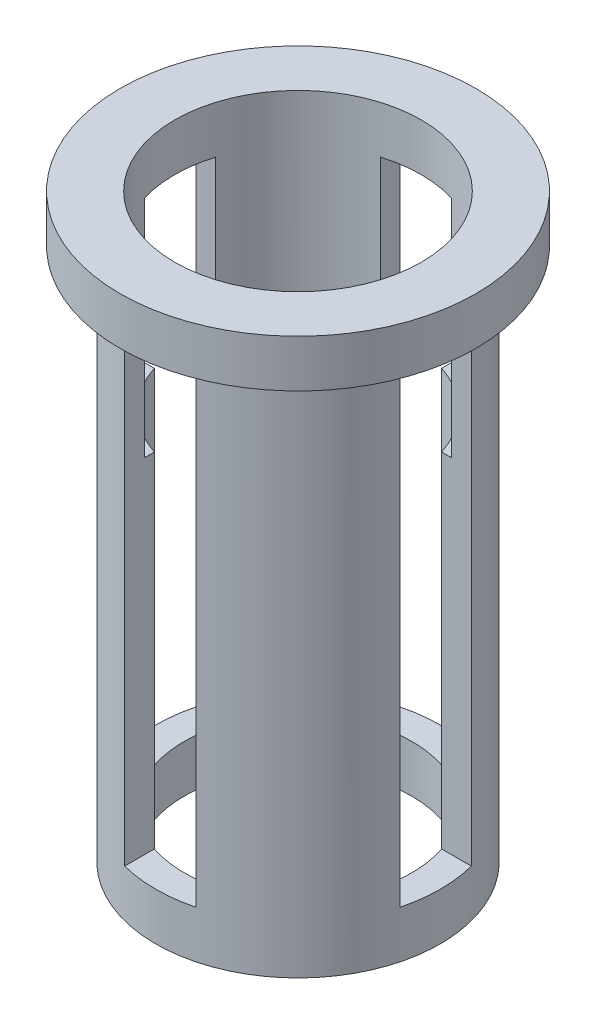
ISO-10303-21;
HEADER;
FILE_DESCRIPTION(('STEP AP214'),'2;1');
FILE_NAME('part.step','',(''),(''),'','','');
FILE_SCHEMA(('AUTOMOTIVE_DESIGN { 1 0 10303 214 1 1 1 1 }'));
ENDSEC;
DATA;
#1=APPLICATION_CONTEXT('core data for automotive mechanical design processes');
#2=APPLICATION_PROTOCOL_DEFINITION('international standard','automotive_design',2000,#1);
#3=PRODUCT_CONTEXT('',#1,'mechanical');
#4=PRODUCT('Part','Part','',(#3));
#5=PRODUCT_RELATED_PRODUCT_CATEGORY('part','',(#4));
#6=PRODUCT_DEFINITION_FORMATION('','',#4);
#7=PRODUCT_DEFINITION_CONTEXT('part definition',#1,'design');
#8=PRODUCT_DEFINITION('design','',#6,#7);
#9=PRODUCT_DEFINITION_SHAPE('','',#8);
#10=(LENGTH_UNIT() NAMED_UNIT(*) SI_UNIT(.MILLI.,.METRE.));
#11=(NAMED_UNIT(*) PLANE_ANGLE_UNIT() SI_UNIT($,.RADIAN.));
#12=(NAMED_UNIT(*) SI_UNIT($,.STERADIAN.) SOLID_ANGLE_UNIT());
#13=UNCERTAINTY_MEASURE_WITH_UNIT(LENGTH_MEASURE(1.E-05),#10,'distance_accuracy_value','');
#14=(GEOMETRIC_REPRESENTATION_CONTEXT(3) GLOBAL_UNCERTAINTY_ASSIGNED_CONTEXT((#13)) GLOBAL_UNIT_ASSIGNED_CONTEXT((#10,
#11,#12)) REPRESENTATION_CONTEXT('',''));
#15=CARTESIAN_POINT('',(0.,0.,0.));
#16=DIRECTION('',(0.,0.,1.));
#17=DIRECTION('',(1.,0.,0.));
#18=AXIS2_PLACEMENT_3D('',#15,#16,#17);
#19=CARTESIAN_POINT('',(0.,-7.62,0.));
#20=DIRECTION('',(0.,-1.,0.));
#21=DIRECTION('',(0.,0.,-1.));
#22=AXIS2_PLACEMENT_3D('',#19,#20,#21);
#23=PLANE('',#22);
#24=DIRECTION('',(1.,0.,0.));
#25=VECTOR('',#24,1.);
#26=CARTESIAN_POINT('',(0.,-7.62,1.905));
#27=LINE('',#26,#25);
#28=CARTESIAN_POINT('',(5.79069866251042,-7.62,1.905));
#29=VERTEX_POINT('',#28);
#30=CARTESIAN_POINT('',(6.32327375652834,-7.62,1.905));
#31=VERTEX_POINT('',#30);
#32=EDGE_CURVE('E209',#29,#31,#27,.T.);
#33=ORIENTED_EDGE('',*,*,#32,.F.);
#34=CARTESIAN_POINT('',(0.,-7.62,0.));
#35=DIRECTION('',(0.,-1.,0.));
#36=DIRECTION('',(0.,0.,-1.));
#37=AXIS2_PLACEMENT_3D('',#34,#35,#36);
#38=CIRCLE('',#37,6.096);
#39=CARTESIAN_POINT('',(1.905,-7.62,5.79069866251042));
#40=VERTEX_POINT('',#39);
#41=EDGE_CURVE('E293',#29,#40,#38,.T.);
#42=ORIENTED_EDGE('',*,*,#41,.T.);
#43=DIRECTION('',(0.,0.,1.));
#44=VECTOR('',#43,1.);
#45=CARTESIAN_POINT('',(1.90499999999999,-7.62,0.));
#46=LINE('',#45,#44);
#47=CARTESIAN_POINT('',(1.90499999999999,-7.62,6.32327375652834));
#48=VERTEX_POINT('',#47);
#49=EDGE_CURVE('E268',#40,#48,#46,.T.);
#50=ORIENTED_EDGE('',*,*,#49,.T.);
#51=CARTESIAN_POINT('',(0.,-7.62,0.));
#52=DIRECTION('',(0.,-1.,0.));
#53=DIRECTION('',(0.,0.,-1.));
#54=AXIS2_PLACEMENT_3D('',#51,#52,#53);
#55=CIRCLE('',#54,6.604);
#56=EDGE_CURVE('E303',#31,#48,#55,.T.);
#57=ORIENTED_EDGE('',*,*,#56,.F.);
#58=EDGE_LOOP('',(#33,#42,#50,#57));
#59=FACE_BOUND('',#58,.T.);
#60=ADVANCED_FACE('F41',(#59),#23,.F.);
#61=CARTESIAN_POINT('',(0.,2.54,0.));
#62=DIRECTION('',(0.,-1.,0.));
#63=DIRECTION('',(0.,0.,-1.));
#64=AXIS2_PLACEMENT_3D('',#61,#62,#63);
#65=CYLINDRICAL_SURFACE('',#64,6.604);
#66=CARTESIAN_POINT('',(0.,2.54,0.));
#67=DIRECTION('',(0.,1.,0.));
#68=DIRECTION('',(0.,0.,1.));
#69=AXIS2_PLACEMENT_3D('',#66,#67,#68);
#70=CIRCLE('',#69,6.604);
#71=CARTESIAN_POINT('',(0.,2.54,6.604));
#72=VERTEX_POINT('',#71);
#73=EDGE_CURVE('E302',#72,#72,#70,.T.);
#74=ORIENTED_EDGE('',*,*,#73,.T.);
#75=EDGE_LOOP('',(#74));
#76=FACE_BOUND('',#75,.T.);
#77=CARTESIAN_POINT('',(0.,0.,0.));
#78=DIRECTION('',(0.,1.,0.));
#79=DIRECTION('',(-1.,0.,0.));
#80=AXIS2_PLACEMENT_3D('',#77,#78,#79);
#81=CIRCLE('',#80,6.604);
#82=CARTESIAN_POINT('',(6.32327375652834,0.,1.905));
#83=VERTEX_POINT('',#82);
#84=CARTESIAN_POINT('',(6.32327375652834,0.,-1.90499999999999));
#85=VERTEX_POINT('',#84);
#86=EDGE_CURVE('E233',#83,#85,#81,.T.);
#87=ORIENTED_EDGE('',*,*,#86,.F.);
#88=DIRECTION('',(0.,-1.,0.));
#89=VECTOR('',#88,1.);
#90=CARTESIAN_POINT('',(6.32327375652834,2.54,1.905));
#91=LINE('',#90,#89);
#92=EDGE_CURVE('E415',#83,#31,#91,.T.);
#93=ORIENTED_EDGE('',*,*,#92,.T.);
#94=ORIENTED_EDGE('',*,*,#56,.T.);
#95=DIRECTION('',(0.,-1.,0.));
#96=VECTOR('',#95,1.);
#97=CARTESIAN_POINT('',(1.90499999999999,2.54,6.32327375652834));
#98=LINE('',#97,#96);
#99=CARTESIAN_POINT('',(1.90499999999999,0.,6.32327375652834));
#100=VERTEX_POINT('',#99);
#101=EDGE_CURVE('E271',#100,#48,#98,.T.);
#102=ORIENTED_EDGE('',*,*,#101,.F.);
#103=CARTESIAN_POINT('',(0.,0.,0.));
#104=DIRECTION('',(0.,1.,0.));
#105=DIRECTION('',(0.,0.,1.));
#106=AXIS2_PLACEMENT_3D('',#103,#104,#105);
#107=CIRCLE('',#106,6.604);
#108=CARTESIAN_POINT('',(-1.905,0.,6.32327375652834));
#109=VERTEX_POINT('',#108);
#110=EDGE_CURVE('E283',#109,#100,#107,.T.);
#111=ORIENTED_EDGE('',*,*,#110,.F.);
#112=DIRECTION('',(0.,-1.,0.));
#113=VECTOR('',#112,1.);
#114=CARTESIAN_POINT('',(-1.905,2.54,6.32327375652834));
#115=LINE('',#114,#113);
#116=CARTESIAN_POINT('',(-1.905,-7.62,6.32327375652834));
#117=VERTEX_POINT('',#116);
#118=EDGE_CURVE('E256',#117,#109,#115,.F.);
#119=ORIENTED_EDGE('',*,*,#118,.F.);
#120=CARTESIAN_POINT('',(-6.32327375652834,-7.62,1.905));
#121=VERTEX_POINT('',#120);
#122=EDGE_CURVE('E304',#117,#121,#55,.T.);
#123=ORIENTED_EDGE('',*,*,#122,.T.);
#124=DIRECTION('',(0.,-1.,0.));
#125=VECTOR('',#124,1.);
#126=CARTESIAN_POINT('',(-6.32327375652834,2.54,1.905));
#127=LINE('',#126,#125);
#128=CARTESIAN_POINT('',(-6.32327375652834,0.,1.905));
#129=VERTEX_POINT('',#128);
#130=EDGE_CURVE('E420',#121,#129,#127,.F.);
#131=ORIENTED_EDGE('',*,*,#130,.T.);
#132=CARTESIAN_POINT('',(-6.32327375652834,0.,-1.90499999999999));
#133=VERTEX_POINT('',#132);
#134=EDGE_CURVE('E227',#133,#129,#81,.T.);
#135=ORIENTED_EDGE('',*,*,#134,.F.);
#136=DIRECTION('',(0.,-1.,0.));
#137=VECTOR('',#136,1.);
#138=CARTESIAN_POINT('',(-6.32327375652834,2.54,-1.90499999999999));
#139=LINE('',#138,#137);
#140=CARTESIAN_POINT('',(-6.32327375652834,-7.62,-1.905));
#141=VERTEX_POINT('',#140);
#142=EDGE_CURVE('E408',#141,#133,#139,.F.);
#143=ORIENTED_EDGE('',*,*,#142,.F.);
#144=CARTESIAN_POINT('',(-1.905,-7.62,-6.32327375652834));
#145=VERTEX_POINT('',#144);
#146=EDGE_CURVE('E298',#141,#145,#55,.T.);
#147=ORIENTED_EDGE('',*,*,#146,.T.);
#148=DIRECTION('',(0.,-1.,0.));
#149=VECTOR('',#148,1.);
#150=CARTESIAN_POINT('',(-1.905,2.54,-6.32327375652834));
#151=LINE('',#150,#149);
#152=CARTESIAN_POINT('',(-1.905,0.,-6.32327375652834));
#153=VERTEX_POINT('',#152);
#154=EDGE_CURVE('E252',#153,#145,#151,.T.);
#155=ORIENTED_EDGE('',*,*,#154,.F.);
#156=CARTESIAN_POINT('',(1.90499999999999,0.,-6.32327375652834));
#157=VERTEX_POINT('',#156);
#158=EDGE_CURVE('E285',#157,#153,#107,.T.);
#159=ORIENTED_EDGE('',*,*,#158,.F.);
#160=DIRECTION('',(0.,-1.,0.));
#161=VECTOR('',#160,1.);
#162=CARTESIAN_POINT('',(1.90499999999999,2.54,-6.32327375652834));
#163=LINE('',#162,#161);
#164=CARTESIAN_POINT('',(1.90499999999999,-7.62,-6.32327375652834));
#165=VERTEX_POINT('',#164);
#166=EDGE_CURVE('E275',#165,#157,#163,.F.);
#167=ORIENTED_EDGE('',*,*,#166,.F.);
#168=CARTESIAN_POINT('',(6.32327375652834,-7.62,-1.905));
#169=VERTEX_POINT('',#168);
#170=EDGE_CURVE('E299',#165,#169,#55,.T.);
#171=ORIENTED_EDGE('',*,*,#170,.T.);
#172=DIRECTION('',(0.,-1.,0.));
#173=VECTOR('',#172,1.);
#174=CARTESIAN_POINT('',(6.32327375652834,2.54,-1.90499999999999));
#175=LINE('',#174,#173);
#176=EDGE_CURVE('E402',#85,#169,#175,.T.);
#177=ORIENTED_EDGE('',*,*,#176,.F.);
#178=EDGE_LOOP('',(#87,#93,#94,#102,#111,#119,#123,#131,#135,#143,#147,#155,#159,#167,#171,#177));
#179=FACE_BOUND('',#178,.T.);
#180=ADVANCED_FACE('F401',(#76,#179),#65,.F.);
#181=CARTESIAN_POINT('',(0.,-7.62,0.));
#182=DIRECTION('',(0.,1.,0.));
#183=DIRECTION('',(0.,0.,1.));
#184=AXIS2_PLACEMENT_3D('',#181,#182,#183);
#185=CYLINDRICAL_SURFACE('',#184,7.62);
#186=CARTESIAN_POINT('',(0.,-28.575,0.));
#187=DIRECTION('',(0.,-1.,0.));
#188=DIRECTION('',(0.,0.,-1.));
#189=AXIS2_PLACEMENT_3D('',#186,#187,#188);
#190=CIRCLE('',#189,7.62);
#191=CARTESIAN_POINT('',(0.,-28.575,-7.62));
#192=VERTEX_POINT('',#191);
#193=EDGE_CURVE('E289',#192,#192,#190,.T.);
#194=ORIENTED_EDGE('',*,*,#193,.F.);
#195=EDGE_LOOP('',(#194));
#196=FACE_BOUND('',#195,.T.);
#197=CARTESIAN_POINT('',(0.,-26.035,0.));
#198=DIRECTION('',(0.,1.,0.));
#199=DIRECTION('',(-1.,0.,0.));
#200=AXIS2_PLACEMENT_3D('',#197,#198,#199);
#201=CIRCLE('',#200,7.62);
#202=CARTESIAN_POINT('',(7.37803327452513,-26.035,1.905));
#203=VERTEX_POINT('',#202);
#204=CARTESIAN_POINT('',(7.37803327452513,-26.035,-1.905));
#205=VERTEX_POINT('',#204);
#206=EDGE_CURVE('E56',#203,#205,#201,.T.);
#207=ORIENTED_EDGE('',*,*,#206,.F.);
#208=DIRECTION('',(0.,1.,0.));
#209=VECTOR('',#208,1.);
#210=CARTESIAN_POINT('',(7.37803327452513,-7.62,1.905));
#211=LINE('',#210,#209);
#212=CARTESIAN_POINT('',(7.37803327452513,0.,1.905));
#213=VERTEX_POINT('',#212);
#214=EDGE_CURVE('E228',#213,#203,#211,.F.);
#215=ORIENTED_EDGE('',*,*,#214,.F.);
#216=CARTESIAN_POINT('',(0.,0.,0.));
#217=DIRECTION('',(0.,1.,0.));
#218=DIRECTION('',(0.,0.,1.));
#219=AXIS2_PLACEMENT_3D('',#216,#217,#218);
#220=CIRCLE('',#219,7.62);
#221=CARTESIAN_POINT('',(1.90499999999999,0.,7.37803327452513));
#222=VERTEX_POINT('',#221);
#223=EDGE_CURVE('E311',#213,#222,#220,.F.);
#224=ORIENTED_EDGE('',*,*,#223,.T.);
#225=DIRECTION('',(0.,1.,0.));
#226=VECTOR('',#225,1.);
#227=CARTESIAN_POINT('',(1.90499999999999,-7.62,7.37803327452513));
#228=LINE('',#227,#226);
#229=CARTESIAN_POINT('',(1.905,-26.035,7.37803327452513));
#230=VERTEX_POINT('',#229);
#231=EDGE_CURVE('E277',#222,#230,#228,.F.);
#232=ORIENTED_EDGE('',*,*,#231,.T.);
#233=CARTESIAN_POINT('',(0.,-26.035,0.));
#234=DIRECTION('',(0.,-1.,0.));
#235=DIRECTION('',(0.,0.,-1.));
#236=AXIS2_PLACEMENT_3D('',#233,#234,#235);
#237=CIRCLE('',#236,7.62);
#238=CARTESIAN_POINT('',(-1.905,-26.035,7.37803327452513));
#239=VERTEX_POINT('',#238);
#240=EDGE_CURVE('E267',#230,#239,#237,.T.);
#241=ORIENTED_EDGE('',*,*,#240,.T.);
#242=DIRECTION('',(0.,1.,0.));
#243=VECTOR('',#242,1.);
#244=CARTESIAN_POINT('',(-1.905,-7.62,7.37803327452513));
#245=LINE('',#244,#243);
#246=CARTESIAN_POINT('',(-1.905,0.,7.37803327452513));
#247=VERTEX_POINT('',#246);
#248=EDGE_CURVE('E261',#239,#247,#245,.T.);
#249=ORIENTED_EDGE('',*,*,#248,.T.);
#250=CARTESIAN_POINT('',(-7.37803327452513,0.,1.905));
#251=VERTEX_POINT('',#250);
#252=EDGE_CURVE('E318',#247,#251,#220,.F.);
#253=ORIENTED_EDGE('',*,*,#252,.T.);
#254=DIRECTION('',(0.,1.,0.));
#255=VECTOR('',#254,1.);
#256=CARTESIAN_POINT('',(-7.37803327452513,-7.62,1.905));
#257=LINE('',#256,#255);
#258=CARTESIAN_POINT('',(-7.37803327452513,-26.035,1.905));
#259=VERTEX_POINT('',#258);
#260=EDGE_CURVE('E225',#259,#251,#257,.T.);
#261=ORIENTED_EDGE('',*,*,#260,.F.);
#262=CARTESIAN_POINT('',(-7.37803327452513,-26.035,-1.905));
#263=VERTEX_POINT('',#262);
#264=EDGE_CURVE('E215',#263,#259,#201,.T.);
#265=ORIENTED_EDGE('',*,*,#264,.F.);
#266=DIRECTION('',(0.,1.,0.));
#267=VECTOR('',#266,1.);
#268=CARTESIAN_POINT('',(-7.37803327452513,-7.62,-1.905));
#269=LINE('',#268,#267);
#270=CARTESIAN_POINT('',(-7.37803327452513,0.,-1.905));
#271=VERTEX_POINT('',#270);
#272=EDGE_CURVE('E201',#263,#271,#269,.T.);
#273=ORIENTED_EDGE('',*,*,#272,.T.);
#274=CARTESIAN_POINT('',(-1.905,0.,-7.37803327452513));
#275=VERTEX_POINT('',#274);
#276=EDGE_CURVE('E317',#271,#275,#220,.F.);
#277=ORIENTED_EDGE('',*,*,#276,.T.);
#278=DIRECTION('',(0.,1.,0.));
#279=VECTOR('',#278,1.);
#280=CARTESIAN_POINT('',(-1.905,-7.62,-7.37803327452513));
#281=LINE('',#280,#279);
#282=CARTESIAN_POINT('',(-1.905,-26.035,-7.37803327452513));
#283=VERTEX_POINT('',#282);
#284=EDGE_CURVE('E258',#275,#283,#281,.F.);
#285=ORIENTED_EDGE('',*,*,#284,.T.);
#286=CARTESIAN_POINT('',(1.905,-26.035,-7.37803327452513));
#287=VERTEX_POINT('',#286);
#288=EDGE_CURVE('E264',#283,#287,#237,.T.);
#289=ORIENTED_EDGE('',*,*,#288,.T.);
#290=DIRECTION('',(0.,1.,0.));
#291=VECTOR('',#290,1.);
#292=CARTESIAN_POINT('',(1.90499999999999,-7.62,-7.37803327452513));
#293=LINE('',#292,#291);
#294=CARTESIAN_POINT('',(1.90499999999999,0.,-7.37803327452513));
#295=VERTEX_POINT('',#294);
#296=EDGE_CURVE('E280',#287,#295,#293,.T.);
#297=ORIENTED_EDGE('',*,*,#296,.T.);
#298=CARTESIAN_POINT('',(7.37803327452513,0.,-1.90499999999999));
#299=VERTEX_POINT('',#298);
#300=EDGE_CURVE('E314',#295,#299,#220,.F.);
#301=ORIENTED_EDGE('',*,*,#300,.T.);
#302=DIRECTION('',(0.,1.,0.));
#303=VECTOR('',#302,1.);
#304=CARTESIAN_POINT('',(7.37803327452513,-7.62,-1.905));
#305=LINE('',#304,#303);
#306=EDGE_CURVE('E210',#299,#205,#305,.F.);
#307=ORIENTED_EDGE('',*,*,#306,.T.);
#308=EDGE_LOOP('',(#207,#215,#224,#232,#241,#249,#253,#261,#265,#273,#277,#285,#289,#297,#301,#307));
#309=FACE_BOUND('',#308,.T.);
#310=ADVANCED_FACE('F223',(#196,#309),#185,.T.);
#311=DIRECTION('',(1.,0.,0.));
#312=VECTOR('',#311,1.);
#313=CARTESIAN_POINT('',(0.,-7.62,1.905));
#314=LINE('',#313,#312);
#315=CARTESIAN_POINT('',(-5.79069866251042,-7.62,1.905));
#316=VERTEX_POINT('',#315);
#317=EDGE_CURVE('E418',#121,#316,#314,.T.);
#318=ORIENTED_EDGE('',*,*,#317,.F.);
#319=ORIENTED_EDGE('',*,*,#122,.F.);
#320=DIRECTION('',(0.,0.,-1.));
#321=VECTOR('',#320,1.);
#322=CARTESIAN_POINT('',(-1.905,-7.62,0.));
#323=LINE('',#322,#321);
#324=CARTESIAN_POINT('',(-1.905,-7.62,5.79069866251042));
#325=VERTEX_POINT('',#324);
#326=EDGE_CURVE('E253',#117,#325,#323,.T.);
#327=ORIENTED_EDGE('',*,*,#326,.T.);
#328=EDGE_CURVE('E295',#325,#316,#38,.T.);
#329=ORIENTED_EDGE('',*,*,#328,.T.);
#330=EDGE_LOOP('',(#318,#319,#327,#329));
#331=FACE_BOUND('',#330,.T.);
#332=ADVANCED_FACE('F448',(#331),#23,.F.);
#333=CARTESIAN_POINT('',(0.,-28.575,0.));
#334=DIRECTION('',(0.,1.,0.));
#335=DIRECTION('',(0.,0.,1.));
#336=AXIS2_PLACEMENT_3D('',#333,#334,#335);
#337=CYLINDRICAL_SURFACE('',#336,6.096);
#338=CARTESIAN_POINT('',(0.,-28.575,0.));
#339=DIRECTION('',(0.,-1.,0.));
#340=DIRECTION('',(0.,0.,-1.));
#341=AXIS2_PLACEMENT_3D('',#338,#339,#340);
#342=CIRCLE('',#341,6.096);
#343=CARTESIAN_POINT('',(0.,-28.575,-6.096));
#344=VERTEX_POINT('',#343);
#345=EDGE_CURVE('E286',#344,#344,#342,.T.);
#346=ORIENTED_EDGE('',*,*,#345,.T.);
#347=EDGE_LOOP('',(#346));
#348=FACE_BOUND('',#347,.T.);
#349=CARTESIAN_POINT('',(0.,-26.035,0.));
#350=DIRECTION('',(0.,1.,0.));
#351=DIRECTION('',(-1.,0.,0.));
#352=AXIS2_PLACEMENT_3D('',#349,#350,#351);
#353=CIRCLE('',#352,6.096);
#354=CARTESIAN_POINT('',(-5.79069866251042,-26.035,-1.905));
#355=VERTEX_POINT('',#354);
#356=CARTESIAN_POINT('',(-5.79069866251042,-26.035,1.905));
#357=VERTEX_POINT('',#356);
#358=EDGE_CURVE('E49',#355,#357,#353,.T.);
#359=ORIENTED_EDGE('',*,*,#358,.T.);
#360=DIRECTION('',(0.,1.,0.));
#361=VECTOR('',#360,1.);
#362=CARTESIAN_POINT('',(-5.79069866251042,-28.575,1.905));
#363=LINE('',#362,#361);
#364=EDGE_CURVE('E12',#357,#316,#363,.T.);
#365=ORIENTED_EDGE('',*,*,#364,.T.);
#366=ORIENTED_EDGE('',*,*,#328,.F.);
#367=DIRECTION('',(0.,1.,0.));
#368=VECTOR('',#367,1.);
#369=CARTESIAN_POINT('',(-1.905,-28.575,5.79069866251042));
#370=LINE('',#369,#368);
#371=CARTESIAN_POINT('',(-1.905,-26.035,5.79069866251042));
#372=VERTEX_POINT('',#371);
#373=EDGE_CURVE('E326',#372,#325,#370,.T.);
#374=ORIENTED_EDGE('',*,*,#373,.F.);
#375=CARTESIAN_POINT('',(0.,-26.035,0.));
#376=DIRECTION('',(0.,-1.,0.));
#377=DIRECTION('',(0.,0.,-1.));
#378=AXIS2_PLACEMENT_3D('',#375,#376,#377);
#379=CIRCLE('',#378,6.096);
#380=CARTESIAN_POINT('',(1.905,-26.035,5.79069866251042));
#381=VERTEX_POINT('',#380);
#382=EDGE_CURVE('E324',#381,#372,#379,.T.);
#383=ORIENTED_EDGE('',*,*,#382,.F.);
#384=DIRECTION('',(0.,1.,0.));
#385=VECTOR('',#384,1.);
#386=CARTESIAN_POINT('',(1.905,-28.575,5.79069866251042));
#387=LINE('',#386,#385);
#388=EDGE_CURVE('E328',#40,#381,#387,.F.);
#389=ORIENTED_EDGE('',*,*,#388,.F.);
#390=ORIENTED_EDGE('',*,*,#41,.F.);
#391=DIRECTION('',(0.,1.,0.));
#392=VECTOR('',#391,1.);
#393=CARTESIAN_POINT('',(5.79069866251042,-28.575,1.905));
#394=LINE('',#393,#392);
#395=CARTESIAN_POINT('',(5.79069866251042,-26.035,1.905));
#396=VERTEX_POINT('',#395);
#397=EDGE_CURVE('E335',#29,#396,#394,.F.);
#398=ORIENTED_EDGE('',*,*,#397,.T.);
#399=CARTESIAN_POINT('',(5.79069866251042,-26.035,-1.905));
#400=VERTEX_POINT('',#399);
#401=EDGE_CURVE('E332',#396,#400,#353,.T.);
#402=ORIENTED_EDGE('',*,*,#401,.T.);
#403=DIRECTION('',(0.,1.,0.));
#404=VECTOR('',#403,1.);
#405=CARTESIAN_POINT('',(5.79069866251042,-28.575,-1.905));
#406=LINE('',#405,#404);
#407=CARTESIAN_POINT('',(5.79069866251042,-7.62,-1.905));
#408=VERTEX_POINT('',#407);
#409=EDGE_CURVE('E330',#408,#400,#406,.F.);
#410=ORIENTED_EDGE('',*,*,#409,.F.);
#411=CARTESIAN_POINT('',(1.905,-7.62,-5.79069866251042));
#412=VERTEX_POINT('',#411);
#413=EDGE_CURVE('E290',#412,#408,#38,.T.);
#414=ORIENTED_EDGE('',*,*,#413,.F.);
#415=DIRECTION('',(0.,1.,0.));
#416=VECTOR('',#415,1.);
#417=CARTESIAN_POINT('',(1.905,-28.575,-5.79069866251042));
#418=LINE('',#417,#416);
#419=CARTESIAN_POINT('',(1.905,-26.035,-5.79069866251042));
#420=VERTEX_POINT('',#419);
#421=EDGE_CURVE('E323',#420,#412,#418,.T.);
#422=ORIENTED_EDGE('',*,*,#421,.F.);
#423=CARTESIAN_POINT('',(-1.905,-26.035,-5.79069866251042));
#424=VERTEX_POINT('',#423);
#425=EDGE_CURVE('E321',#424,#420,#379,.T.);
#426=ORIENTED_EDGE('',*,*,#425,.F.);
#427=DIRECTION('',(0.,1.,0.));
#428=VECTOR('',#427,1.);
#429=CARTESIAN_POINT('',(-1.905,-28.575,-5.79069866251042));
#430=LINE('',#429,#428);
#431=CARTESIAN_POINT('',(-1.905,-7.62,-5.79069866251042));
#432=VERTEX_POINT('',#431);
#433=EDGE_CURVE('E319',#432,#424,#430,.F.);
#434=ORIENTED_EDGE('',*,*,#433,.F.);
#435=CARTESIAN_POINT('',(-5.79069866251042,-7.62,-1.905));
#436=VERTEX_POINT('',#435);
#437=EDGE_CURVE('E294',#436,#432,#38,.T.);
#438=ORIENTED_EDGE('',*,*,#437,.F.);
#439=DIRECTION('',(0.,1.,0.));
#440=VECTOR('',#439,1.);
#441=CARTESIAN_POINT('',(-5.79069866251042,-28.575,-1.905));
#442=LINE('',#441,#440);
#443=EDGE_CURVE('E337',#355,#436,#442,.T.);
#444=ORIENTED_EDGE('',*,*,#443,.F.);
#445=EDGE_LOOP('',(#359,#365,#366,#374,#383,#389,#390,#398,#402,#410,#414,#422,#426,#434,#438,#444));
#446=FACE_BOUND('',#445,.T.);
#447=ADVANCED_FACE('F340',(#348,#446),#337,.F.);
#448=ORIENTED_EDGE('',*,*,#413,.T.);
#449=DIRECTION('',(1.,0.,0.));
#450=VECTOR('',#449,1.);
#451=CARTESIAN_POINT('',(0.,-7.62,-1.905));
#452=LINE('',#451,#450);
#453=EDGE_CURVE('E397',#408,#169,#452,.T.);
#454=ORIENTED_EDGE('',*,*,#453,.T.);
#455=ORIENTED_EDGE('',*,*,#170,.F.);
#456=EDGE_CURVE('E272',#165,#412,#46,.T.);
#457=ORIENTED_EDGE('',*,*,#456,.T.);
#458=EDGE_LOOP('',(#448,#454,#455,#457));
#459=FACE_BOUND('',#458,.T.);
#460=ADVANCED_FACE('F395',(#459),#23,.F.);
#461=CARTESIAN_POINT('',(0.,0.,0.));
#462=DIRECTION('',(0.,1.,0.));
#463=DIRECTION('',(0.,0.,1.));
#464=AXIS2_PLACEMENT_3D('',#461,#462,#463);
#465=PLANE('',#464);
#466=ORIENTED_EDGE('',*,*,#223,.F.);
#467=DIRECTION('',(1.,0.,0.));
#468=VECTOR('',#467,1.);
#469=CARTESIAN_POINT('',(-9.525,0.,1.905));
#470=LINE('',#469,#468);
#471=EDGE_CURVE('E426',#83,#213,#470,.T.);
#472=ORIENTED_EDGE('',*,*,#471,.F.);
#473=ORIENTED_EDGE('',*,*,#86,.T.);
#474=DIRECTION('',(1.,0.,0.));
#475=VECTOR('',#474,1.);
#476=CARTESIAN_POINT('',(-9.525,0.,-1.90499999999999));
#477=LINE('',#476,#475);
#478=EDGE_CURVE('E219',#85,#299,#477,.T.);
#479=ORIENTED_EDGE('',*,*,#478,.T.);
#480=ORIENTED_EDGE('',*,*,#300,.F.);
#481=DIRECTION('',(0.,0.,1.));
#482=VECTOR('',#481,1.);
#483=CARTESIAN_POINT('',(1.90499999999999,0.,-9.525));
#484=LINE('',#483,#482);
#485=EDGE_CURVE('E245',#295,#157,#484,.T.);
#486=ORIENTED_EDGE('',*,*,#485,.T.);
#487=ORIENTED_EDGE('',*,*,#158,.T.);
#488=DIRECTION('',(0.,0.,1.));
#489=VECTOR('',#488,1.);
#490=CARTESIAN_POINT('',(-1.905,0.,-9.525));
#491=LINE('',#490,#489);
#492=EDGE_CURVE('E242',#275,#153,#491,.T.);
#493=ORIENTED_EDGE('',*,*,#492,.F.);
#494=ORIENTED_EDGE('',*,*,#276,.F.);
#495=EDGE_CURVE('E64',#271,#133,#477,.T.);
#496=ORIENTED_EDGE('',*,*,#495,.T.);
#497=ORIENTED_EDGE('',*,*,#134,.T.);
#498=EDGE_CURVE('E429',#251,#129,#470,.T.);
#499=ORIENTED_EDGE('',*,*,#498,.F.);
#500=ORIENTED_EDGE('',*,*,#252,.F.);
#501=EDGE_CURVE('E243',#109,#247,#491,.T.);
#502=ORIENTED_EDGE('',*,*,#501,.F.);
#503=ORIENTED_EDGE('',*,*,#110,.T.);
#504=EDGE_CURVE('E246',#100,#222,#484,.T.);
#505=ORIENTED_EDGE('',*,*,#504,.T.);
#506=EDGE_LOOP('',(#466,#472,#473,#479,#480,#486,#487,#493,#494,#496,#497,#499,#500,#502,#503,#505));
#507=FACE_BOUND('',#506,.T.);
#508=CARTESIAN_POINT('',(0.,0.,0.));
#509=DIRECTION('',(0.,1.,0.));
#510=DIRECTION('',(0.,0.,1.));
#511=AXIS2_PLACEMENT_3D('',#508,#509,#510);
#512=CIRCLE('',#511,9.525);
#513=CARTESIAN_POINT('',(0.,0.,9.525));
#514=VERTEX_POINT('',#513);
#515=EDGE_CURVE('E307',#514,#514,#512,.T.);
#516=ORIENTED_EDGE('',*,*,#515,.F.);
#517=EDGE_LOOP('',(#516));
#518=FACE_BOUND('',#517,.T.);
#519=ADVANCED_FACE('F373',(#507,#518),#465,.F.);
#520=CARTESIAN_POINT('',(0.,2.54,0.));
#521=DIRECTION('',(0.,1.,0.));
#522=DIRECTION('',(0.,0.,1.));
#523=AXIS2_PLACEMENT_3D('',#520,#521,#522);
#524=PLANE('',#523);
#525=CARTESIAN_POINT('',(0.,2.54,0.));
#526=DIRECTION('',(0.,1.,0.));
#527=DIRECTION('',(0.,0.,1.));
#528=AXIS2_PLACEMENT_3D('',#525,#526,#527);
#529=CIRCLE('',#528,9.525);
#530=CARTESIAN_POINT('',(0.,2.54,9.525));
#531=VERTEX_POINT('',#530);
#532=EDGE_CURVE('E308',#531,#531,#529,.T.);
#533=ORIENTED_EDGE('',*,*,#532,.T.);
#534=EDGE_LOOP('',(#533));
#535=FACE_BOUND('',#534,.T.);
#536=ORIENTED_EDGE('',*,*,#73,.F.);
#537=EDGE_LOOP('',(#536));
#538=FACE_BOUND('',#537,.T.);
#539=ADVANCED_FACE('F481',(#535,#538),#524,.T.);
#540=CARTESIAN_POINT('',(0.,2.54,0.));
#541=DIRECTION('',(0.,-1.,0.));
#542=DIRECTION('',(0.,0.,-1.));
#543=AXIS2_PLACEMENT_3D('',#540,#541,#542);
#544=CYLINDRICAL_SURFACE('',#543,9.525);
#545=ORIENTED_EDGE('',*,*,#532,.F.);
#546=EDGE_LOOP('',(#545));
#547=FACE_BOUND('',#546,.T.);
#548=ORIENTED_EDGE('',*,*,#515,.T.);
#549=EDGE_LOOP('',(#548));
#550=FACE_BOUND('',#549,.T.);
#551=ADVANCED_FACE('F43',(#547,#550),#544,.T.);
#552=ORIENTED_EDGE('',*,*,#146,.F.);
#553=DIRECTION('',(1.,0.,0.));
#554=VECTOR('',#553,1.);
#555=CARTESIAN_POINT('',(0.,-7.62,-1.905));
#556=LINE('',#555,#554);
#557=EDGE_CURVE('E410',#141,#436,#556,.T.);
#558=ORIENTED_EDGE('',*,*,#557,.T.);
#559=ORIENTED_EDGE('',*,*,#437,.T.);
#560=EDGE_CURVE('E249',#432,#145,#323,.T.);
#561=ORIENTED_EDGE('',*,*,#560,.T.);
#562=EDGE_LOOP('',(#552,#558,#559,#561));
#563=FACE_BOUND('',#562,.T.);
#564=ADVANCED_FACE('F437',(#563),#23,.F.);
#565=CARTESIAN_POINT('',(0.,-28.575,0.));
#566=DIRECTION('',(0.,-1.,0.));
#567=DIRECTION('',(0.,0.,-1.));
#568=AXIS2_PLACEMENT_3D('',#565,#566,#567);
#569=PLANE('',#568);
#570=ORIENTED_EDGE('',*,*,#193,.T.);
#571=EDGE_LOOP('',(#570));
#572=FACE_BOUND('',#571,.T.);
#573=ORIENTED_EDGE('',*,*,#345,.F.);
#574=EDGE_LOOP('',(#573));
#575=FACE_BOUND('',#574,.T.);
#576=ADVANCED_FACE('F475',(#572,#575),#569,.T.);
#577=CARTESIAN_POINT('',(-1.905,-26.035,-9.525));
#578=DIRECTION('',(-1.,0.,0.));
#579=DIRECTION('',(0.,0.,1.));
#580=AXIS2_PLACEMENT_3D('',#577,#578,#579);
#581=PLANE('',#580);
#582=ORIENTED_EDGE('',*,*,#492,.T.);
#583=ORIENTED_EDGE('',*,*,#154,.T.);
#584=ORIENTED_EDGE('',*,*,#560,.F.);
#585=ORIENTED_EDGE('',*,*,#433,.T.);
#586=DIRECTION('',(0.,0.,1.));
#587=VECTOR('',#586,1.);
#588=CARTESIAN_POINT('',(-1.905,-26.035,-9.525));
#589=LINE('',#588,#587);
#590=EDGE_CURVE('E238',#283,#424,#589,.T.);
#591=ORIENTED_EDGE('',*,*,#590,.F.);
#592=ORIENTED_EDGE('',*,*,#284,.F.);
#593=EDGE_LOOP('',(#582,#583,#584,#585,#591,#592));
#594=FACE_BOUND('',#593,.T.);
#595=ADVANCED_FACE('F380',(#594),#581,.F.);
#596=CARTESIAN_POINT('',(1.905,-26.035,-9.525));
#597=DIRECTION('',(0.,-1.,0.));
#598=DIRECTION('',(0.,0.,-1.));
#599=AXIS2_PLACEMENT_3D('',#596,#597,#598);
#600=PLANE('',#599);
#601=ORIENTED_EDGE('',*,*,#590,.T.);
#602=ORIENTED_EDGE('',*,*,#425,.T.);
#603=DIRECTION('',(0.,0.,1.));
#604=VECTOR('',#603,1.);
#605=CARTESIAN_POINT('',(1.905,-26.035,-9.525));
#606=LINE('',#605,#604);
#607=EDGE_CURVE('E237',#287,#420,#606,.T.);
#608=ORIENTED_EDGE('',*,*,#607,.F.);
#609=ORIENTED_EDGE('',*,*,#288,.F.);
#610=EDGE_LOOP('',(#601,#602,#608,#609));
#611=FACE_BOUND('',#610,.T.);
#612=ADVANCED_FACE('F383',(#611),#600,.F.);
#613=CARTESIAN_POINT('',(1.905,-26.035,-9.525));
#614=DIRECTION('',(1.,0.,0.));
#615=DIRECTION('',(0.,1.,0.));
#616=AXIS2_PLACEMENT_3D('',#613,#614,#615);
#617=PLANE('',#616);
#618=ORIENTED_EDGE('',*,*,#607,.T.);
#619=ORIENTED_EDGE('',*,*,#421,.T.);
#620=ORIENTED_EDGE('',*,*,#456,.F.);
#621=ORIENTED_EDGE('',*,*,#166,.T.);
#622=ORIENTED_EDGE('',*,*,#485,.F.);
#623=ORIENTED_EDGE('',*,*,#296,.F.);
#624=EDGE_LOOP('',(#618,#619,#620,#621,#622,#623));
#625=FACE_BOUND('',#624,.T.);
#626=ADVANCED_FACE('F391',(#625),#617,.F.);
#627=ORIENTED_EDGE('',*,*,#504,.F.);
#628=ORIENTED_EDGE('',*,*,#101,.T.);
#629=ORIENTED_EDGE('',*,*,#49,.F.);
#630=ORIENTED_EDGE('',*,*,#388,.T.);
#631=EDGE_CURVE('E234',#381,#230,#606,.T.);
#632=ORIENTED_EDGE('',*,*,#631,.T.);
#633=ORIENTED_EDGE('',*,*,#231,.F.);
#634=EDGE_LOOP('',(#627,#628,#629,#630,#632,#633));
#635=FACE_BOUND('',#634,.T.);
#636=ADVANCED_FACE('F356',(#635),#617,.F.);
#637=ORIENTED_EDGE('',*,*,#631,.F.);
#638=ORIENTED_EDGE('',*,*,#382,.T.);
#639=EDGE_CURVE('E239',#372,#239,#589,.T.);
#640=ORIENTED_EDGE('',*,*,#639,.T.);
#641=ORIENTED_EDGE('',*,*,#240,.F.);
#642=EDGE_LOOP('',(#637,#638,#640,#641));
#643=FACE_BOUND('',#642,.T.);
#644=ADVANCED_FACE('F363',(#643),#600,.F.);
#645=ORIENTED_EDGE('',*,*,#639,.F.);
#646=ORIENTED_EDGE('',*,*,#373,.T.);
#647=ORIENTED_EDGE('',*,*,#326,.F.);
#648=ORIENTED_EDGE('',*,*,#118,.T.);
#649=ORIENTED_EDGE('',*,*,#501,.T.);
#650=ORIENTED_EDGE('',*,*,#248,.F.);
#651=EDGE_LOOP('',(#645,#646,#647,#648,#649,#650));
#652=FACE_BOUND('',#651,.T.);
#653=ADVANCED_FACE('F454',(#652),#581,.F.);
#654=CARTESIAN_POINT('',(-9.52500000000003,-26.035,-1.905));
#655=DIRECTION('',(0.,0.,-1.));
#656=DIRECTION('',(0.,1.,0.));
#657=AXIS2_PLACEMENT_3D('',#654,#655,#656);
#658=PLANE('',#657);
#659=ORIENTED_EDGE('',*,*,#478,.F.);
#660=ORIENTED_EDGE('',*,*,#176,.T.);
#661=ORIENTED_EDGE('',*,*,#453,.F.);
#662=ORIENTED_EDGE('',*,*,#409,.T.);
#663=DIRECTION('',(1.,0.,0.));
#664=VECTOR('',#663,1.);
#665=CARTESIAN_POINT('',(-9.52500000000003,-26.035,-1.905));
#666=LINE('',#665,#664);
#667=EDGE_CURVE('E220',#400,#205,#666,.T.);
#668=ORIENTED_EDGE('',*,*,#667,.T.);
#669=ORIENTED_EDGE('',*,*,#306,.F.);
#670=EDGE_LOOP('',(#659,#660,#661,#662,#668,#669));
#671=FACE_BOUND('',#670,.T.);
#672=ADVANCED_FACE('F452',(#671),#658,.F.);
#673=CARTESIAN_POINT('',(-9.52500000000003,-26.035,1.905));
#674=DIRECTION('',(0.,0.,-1.));
#675=DIRECTION('',(-1.,0.,0.));
#676=AXIS2_PLACEMENT_3D('',#673,#674,#675);
#677=PLANE('',#676);
#678=ORIENTED_EDGE('',*,*,#214,.T.);
#679=DIRECTION('',(1.,0.,0.));
#680=VECTOR('',#679,1.);
#681=CARTESIAN_POINT('',(-9.52500000000003,-26.035,1.905));
#682=LINE('',#681,#680);
#683=EDGE_CURVE('E425',#396,#203,#682,.T.);
#684=ORIENTED_EDGE('',*,*,#683,.F.);
#685=ORIENTED_EDGE('',*,*,#397,.F.);
#686=ORIENTED_EDGE('',*,*,#32,.T.);
#687=ORIENTED_EDGE('',*,*,#92,.F.);
#688=ORIENTED_EDGE('',*,*,#471,.T.);
#689=EDGE_LOOP('',(#678,#684,#685,#686,#687,#688));
#690=FACE_BOUND('',#689,.T.);
#691=ADVANCED_FACE('F424',(#690),#677,.T.);
#692=CARTESIAN_POINT('',(-9.52500000000003,-26.035,-1.905));
#693=DIRECTION('',(0.,1.,0.));
#694=DIRECTION('',(-1.,0.,0.));
#695=AXIS2_PLACEMENT_3D('',#692,#693,#694);
#696=PLANE('',#695);
#697=ORIENTED_EDGE('',*,*,#206,.T.);
#698=ORIENTED_EDGE('',*,*,#667,.F.);
#699=ORIENTED_EDGE('',*,*,#401,.F.);
#700=ORIENTED_EDGE('',*,*,#683,.T.);
#701=EDGE_LOOP('',(#697,#698,#699,#700));
#702=FACE_BOUND('',#701,.T.);
#703=ADVANCED_FACE('F427',(#702),#696,.T.);
#704=ORIENTED_EDGE('',*,*,#264,.T.);
#705=EDGE_CURVE('E428',#259,#357,#682,.T.);
#706=ORIENTED_EDGE('',*,*,#705,.T.);
#707=ORIENTED_EDGE('',*,*,#358,.F.);
#708=EDGE_CURVE('E204',#263,#355,#666,.T.);
#709=ORIENTED_EDGE('',*,*,#708,.F.);
#710=EDGE_LOOP('',(#704,#706,#707,#709));
#711=FACE_BOUND('',#710,.T.);
#712=ADVANCED_FACE('F213',(#711),#696,.T.);
#713=ORIENTED_EDGE('',*,*,#260,.T.);
#714=ORIENTED_EDGE('',*,*,#498,.T.);
#715=ORIENTED_EDGE('',*,*,#130,.F.);
#716=ORIENTED_EDGE('',*,*,#317,.T.);
#717=ORIENTED_EDGE('',*,*,#364,.F.);
#718=ORIENTED_EDGE('',*,*,#705,.F.);
#719=EDGE_LOOP('',(#713,#714,#715,#716,#717,#718));
#720=FACE_BOUND('',#719,.T.);
#721=ADVANCED_FACE('F444',(#720),#677,.T.);
#722=ORIENTED_EDGE('',*,*,#708,.T.);
#723=ORIENTED_EDGE('',*,*,#443,.T.);
#724=ORIENTED_EDGE('',*,*,#557,.F.);
#725=ORIENTED_EDGE('',*,*,#142,.T.);
#726=ORIENTED_EDGE('',*,*,#495,.F.);
#727=ORIENTED_EDGE('',*,*,#272,.F.);
#728=EDGE_LOOP('',(#722,#723,#724,#725,#726,#727));
#729=FACE_BOUND('',#728,.T.);
#730=ADVANCED_FACE('F203',(#729),#658,.F.);
#731=CLOSED_SHELL('',(#60,#180,#310,#332,#447,#460,#519,#539,#551,#564,#576,#595,#612,#626,#636,
#644,#653,#672,#691,#703,#712,#721,#730));
#732=MANIFOLD_SOLID_BREP('B2',#731);
#733=ADVANCED_BREP_SHAPE_REPRESENTATION('',(#18,#732),#14);
#734=SHAPE_DEFINITION_REPRESENTATION(#9,#733);
ENDSEC;
END-ISO-10303-21;
